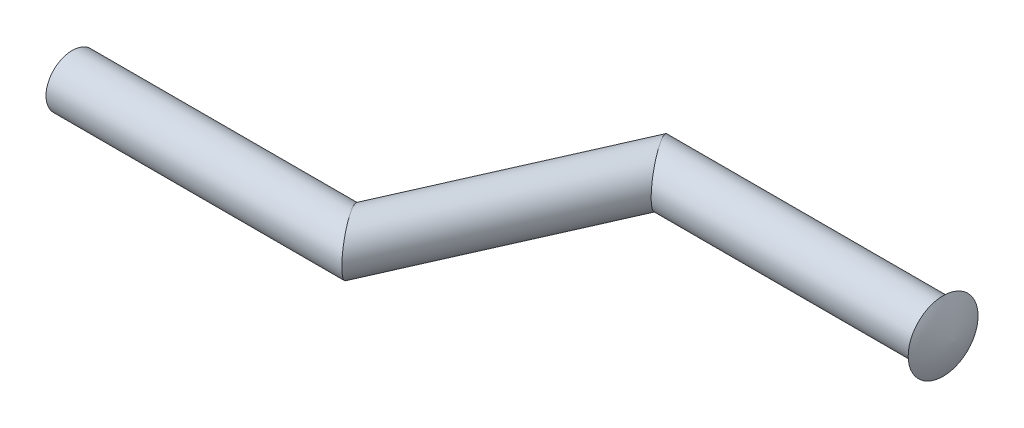
ISO-10303-21;
HEADER;
FILE_DESCRIPTION(('STEP AP214'),'2;1');
FILE_NAME('part.step','',(''),(''),'','','');
FILE_SCHEMA(('AUTOMOTIVE_DESIGN { 1 0 10303 214 1 1 1 1 }'));
ENDSEC;
DATA;
#1=APPLICATION_CONTEXT('core data for automotive mechanical design processes');
#2=APPLICATION_PROTOCOL_DEFINITION('international standard','automotive_design',2000,#1);
#3=PRODUCT_CONTEXT('',#1,'mechanical');
#4=PRODUCT('Part','Part','',(#3));
#5=PRODUCT_RELATED_PRODUCT_CATEGORY('part','',(#4));
#6=PRODUCT_DEFINITION_FORMATION('','',#4);
#7=PRODUCT_DEFINITION_CONTEXT('part definition',#1,'design');
#8=PRODUCT_DEFINITION('design','',#6,#7);
#9=PRODUCT_DEFINITION_SHAPE('','',#8);
#10=(LENGTH_UNIT() NAMED_UNIT(*) SI_UNIT(.MILLI.,.METRE.));
#11=(NAMED_UNIT(*) PLANE_ANGLE_UNIT() SI_UNIT($,.RADIAN.));
#12=(NAMED_UNIT(*) SI_UNIT($,.STERADIAN.) SOLID_ANGLE_UNIT());
#13=UNCERTAINTY_MEASURE_WITH_UNIT(LENGTH_MEASURE(1.E-05),#10,'distance_accuracy_value','');
#14=(GEOMETRIC_REPRESENTATION_CONTEXT(3) GLOBAL_UNCERTAINTY_ASSIGNED_CONTEXT((#13)) GLOBAL_UNIT_ASSIGNED_CONTEXT((#10,
#11,#12)) REPRESENTATION_CONTEXT('',''));
#15=CARTESIAN_POINT('',(0.,0.,0.));
#16=DIRECTION('',(0.,0.,1.));
#17=DIRECTION('',(1.,0.,0.));
#18=AXIS2_PLACEMENT_3D('',#15,#16,#17);
#19=CARTESIAN_POINT('',(-222.882267398916,0.,72.7461736455126));
#20=DIRECTION('',(1.,0.,0.));
#21=DIRECTION('',(0.,0.,-1.));
#22=AXIS2_PLACEMENT_3D('',#19,#20,#21);
#23=PLANE('',#22);
#24=CARTESIAN_POINT('',(-222.882267398916,0.,72.7461736455126));
#25=DIRECTION('',(1.,0.,0.));
#26=DIRECTION('',(0.,0.,-1.));
#27=AXIS2_PLACEMENT_3D('',#24,#25,#26);
#28=CIRCLE('',#27,8.89);
#29=CARTESIAN_POINT('',(-222.882267398916,0.,63.8561736455126));
#30=VERTEX_POINT('',#29);
#31=EDGE_CURVE('E36',#30,#30,#28,.T.);
#32=ORIENTED_EDGE('',*,*,#31,.F.);
#33=EDGE_LOOP('',(#32));
#34=FACE_BOUND('',#33,.T.);
#35=ADVANCED_FACE('F33',(#34),#23,.F.);
#36=CARTESIAN_POINT('',(-121.792394354703,0.,72.7461736455126));
#37=DIRECTION('',(-1.,0.,0.));
#38=DIRECTION('',(0.,0.,1.));
#39=AXIS2_PLACEMENT_3D('',#36,#37,#38);
#40=CYLINDRICAL_SURFACE('',#39,8.89);
#41=CARTESIAN_POINT('',(-128.252610357535,0.,72.7461736455126));
#42=DIRECTION('',(-0.838292149650602,0.,0.545221305374408));
#43=DIRECTION('',(0.545221305374408,0.,0.838292149650602));
#44=AXIS2_PLACEMENT_3D('',#41,#42,#43);
#45=ELLIPSE('',#44,10.6048947299642,8.89);
#46=CARTESIAN_POINT('',(-122.470595809506,0.,81.6361736455126));
#47=VERTEX_POINT('',#46);
#48=EDGE_CURVE('E77',#47,#47,#45,.T.);
#49=ORIENTED_EDGE('',*,*,#48,.T.);
#50=EDGE_LOOP('',(#49));
#51=FACE_BOUND('',#50,.T.);
#52=ORIENTED_EDGE('',*,*,#31,.T.);
#53=EDGE_LOOP('',(#52));
#54=FACE_BOUND('',#53,.T.);
#55=ADVANCED_FACE('F63',(#51,#54),#40,.T.);
#56=CARTESIAN_POINT('',(-93.3655079188289,0.,-5.90534469255629));
#57=DIRECTION('',(-0.405467456331653,0.,0.914109480235239));
#58=DIRECTION('',(0.914109480235239,0.,0.405467456331653));
#59=AXIS2_PLACEMENT_3D('',#56,#57,#58);
#60=CYLINDRICAL_SURFACE('',#59,8.89);
#61=CARTESIAN_POINT('',(-95.9849152688503,0.,0.));
#62=DIRECTION('',(-0.838292149650602,0.,0.545221305374408));
#63=DIRECTION('',(-0.545221305374408,0.,-0.838292149650602));
#64=AXIS2_PLACEMENT_3D('',#61,#62,#63);
#65=ELLIPSE('',#64,10.6048947299642,8.89);
#66=CARTESIAN_POINT('',(-101.76692981688,0.,-8.89));
#67=VERTEX_POINT('',#66);
#68=EDGE_CURVE('E11',#67,#67,#65,.T.);
#69=ORIENTED_EDGE('',*,*,#68,.T.);
#70=EDGE_LOOP('',(#69));
#71=FACE_BOUND('',#70,.T.);
#72=ORIENTED_EDGE('',*,*,#48,.F.);
#73=EDGE_LOOP('',(#72));
#74=FACE_BOUND('',#73,.T.);
#75=ADVANCED_FACE('F57',(#71,#74),#60,.T.);
#76=CARTESIAN_POINT('',(0.,0.,0.));
#77=DIRECTION('',(-1.,0.,0.));
#78=DIRECTION('',(0.,0.,1.));
#79=AXIS2_PLACEMENT_3D('',#76,#77,#78);
#80=CYLINDRICAL_SURFACE('',#79,8.89);
#81=CARTESIAN_POINT('',(0.,0.,0.));
#82=DIRECTION('',(1.,0.,0.));
#83=DIRECTION('',(0.,0.,-1.));
#84=AXIS2_PLACEMENT_3D('',#81,#82,#83);
#85=CIRCLE('',#84,8.89);
#86=CARTESIAN_POINT('',(0.,0.,-8.89));
#87=VERTEX_POINT('',#86);
#88=EDGE_CURVE('E40',#87,#87,#85,.T.);
#89=ORIENTED_EDGE('',*,*,#88,.F.);
#90=EDGE_LOOP('',(#89));
#91=FACE_BOUND('',#90,.T.);
#92=ORIENTED_EDGE('',*,*,#68,.F.);
#93=EDGE_LOOP('',(#92));
#94=FACE_BOUND('',#93,.T.);
#95=ADVANCED_FACE('F52',(#91,#94),#80,.T.);
#96=CARTESIAN_POINT('',(0.,0.,0.));
#97=DIRECTION('',(1.,0.,0.));
#98=DIRECTION('',(0.,0.,-1.));
#99=AXIS2_PLACEMENT_3D('',#96,#97,#98);
#100=PLANE('',#99);
#101=ORIENTED_EDGE('',*,*,#88,.T.);
#102=EDGE_LOOP('',(#101));
#103=FACE_BOUND('',#102,.T.);
#104=CARTESIAN_POINT('',(0.,0.,0.));
#105=DIRECTION('',(-1.,0.,0.));
#106=DIRECTION('',(0.,0.,1.));
#107=AXIS2_PLACEMENT_3D('',#104,#105,#106);
#108=CIRCLE('',#107,11.8604605662378);
#109=CARTESIAN_POINT('',(0.,0.,11.8604605662378));
#110=VERTEX_POINT('',#109);
#111=EDGE_CURVE('E80',#110,#110,#108,.T.);
#112=ORIENTED_EDGE('',*,*,#111,.T.);
#113=EDGE_LOOP('',(#112));
#114=FACE_BOUND('',#113,.T.);
#115=ADVANCED_FACE('F46',(#103,#114),#100,.F.);
#116=CARTESIAN_POINT('',(-27.0940917383905,0.,-2.34195249865787));
#117=DIRECTION('',(0.,-1.,0.));
#118=DIRECTION('',(0.,0.,1.));
#119=AXIS2_PLACEMENT_3D('',#116,#117,#118);
#120=CIRCLE('',#119,30.5908212376562);
#121=TRIMMED_CURVE('',#120,(PARAMETER_VALUE(-1.49416398521679)),
(PARAMETER_VALUE(1.49416398521679)),.T.,.PARAMETER.);
#122=CARTESIAN_POINT('',(-27.0940917383905,0.,0.));
#123=DIRECTION('',(-1.,0.,0.));
#124=AXIS1_PLACEMENT('',#122,#123);
#125=SURFACE_OF_REVOLUTION('',#121,#124);
#126=ORIENTED_EDGE('',*,*,#111,.F.);
#127=EDGE_LOOP('',(#126));
#128=FACE_BOUND('',#127,.T.);
#129=CARTESIAN_POINT('',(3.40695090753014,0.,0.));
#130=VERTEX_POINT('',#129);
#131=VERTEX_LOOP('',#130);
#132=FACE_BOUND('',#131,.T.);
#133=ADVANCED_FACE('F44',(#128,#132),#125,.T.);
#134=CLOSED_SHELL('',(#35,#55,#75,#95,#115,#133));
#135=MANIFOLD_SOLID_BREP('B2',#134);
#136=ADVANCED_BREP_SHAPE_REPRESENTATION('',(#18,#135),#14);
#137=SHAPE_DEFINITION_REPRESENTATION(#9,#136);
ENDSEC;
END-ISO-10303-21;
